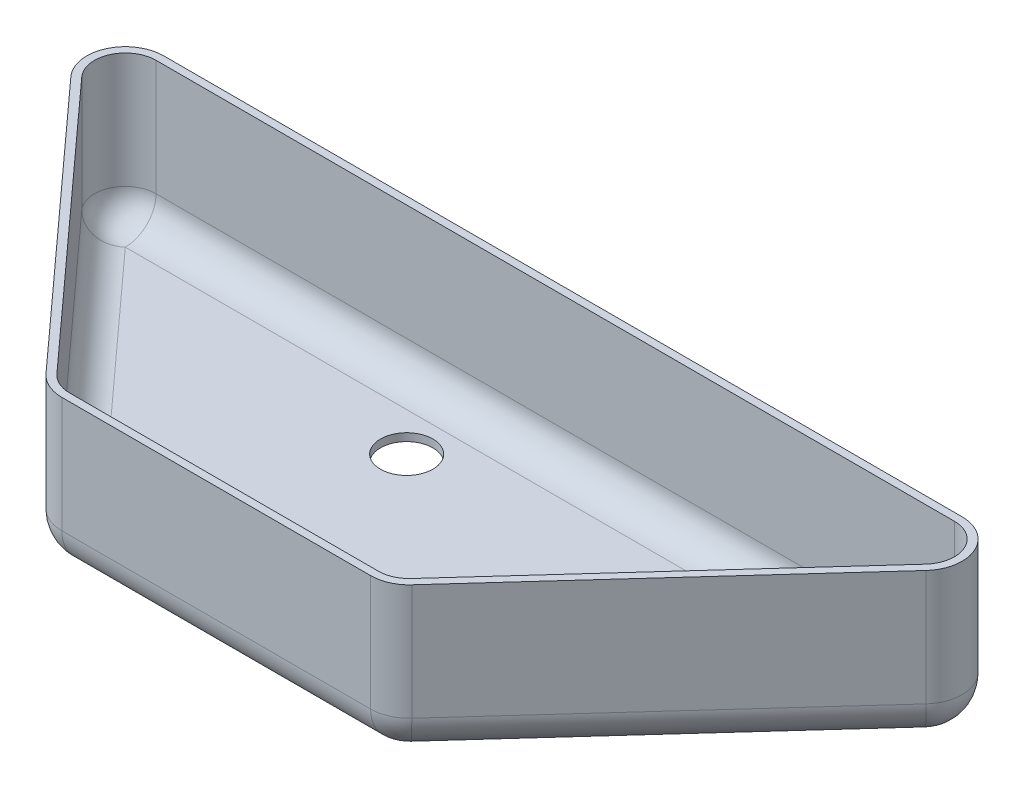
ISO-10303-21;
HEADER;
FILE_DESCRIPTION(('STEP AP214'),'2;1');
FILE_NAME('part.step','',(''),(''),'','','');
FILE_SCHEMA(('AUTOMOTIVE_DESIGN { 1 0 10303 214 1 1 1 1 }'));
ENDSEC;
DATA;
#1=APPLICATION_CONTEXT('core data for automotive mechanical design processes');
#2=APPLICATION_PROTOCOL_DEFINITION('international standard','automotive_design',2000,#1);
#3=PRODUCT_CONTEXT('',#1,'mechanical');
#4=PRODUCT('Part','Part','',(#3));
#5=PRODUCT_RELATED_PRODUCT_CATEGORY('part','',(#4));
#6=PRODUCT_DEFINITION_FORMATION('','',#4);
#7=PRODUCT_DEFINITION_CONTEXT('part definition',#1,'design');
#8=PRODUCT_DEFINITION('design','',#6,#7);
#9=PRODUCT_DEFINITION_SHAPE('','',#8);
#10=(LENGTH_UNIT() NAMED_UNIT(*) SI_UNIT(.MILLI.,.METRE.));
#11=(NAMED_UNIT(*) PLANE_ANGLE_UNIT() SI_UNIT($,.RADIAN.));
#12=(NAMED_UNIT(*) SI_UNIT($,.STERADIAN.) SOLID_ANGLE_UNIT());
#13=UNCERTAINTY_MEASURE_WITH_UNIT(LENGTH_MEASURE(1.E-05),#10,'distance_accuracy_value','');
#14=(GEOMETRIC_REPRESENTATION_CONTEXT(3) GLOBAL_UNCERTAINTY_ASSIGNED_CONTEXT((#13)) GLOBAL_UNIT_ASSIGNED_CONTEXT((#10,
#11,#12)) REPRESENTATION_CONTEXT('',''));
#15=CARTESIAN_POINT('',(0.,0.,0.));
#16=DIRECTION('',(0.,0.,1.));
#17=DIRECTION('',(1.,0.,0.));
#18=AXIS2_PLACEMENT_3D('',#15,#16,#17);
#19=CARTESIAN_POINT('',(50.8914392477294,50.8,-12.7));
#20=DIRECTION('',(0.,1.,0.));
#21=DIRECTION('',(0.,0.,1.));
#22=AXIS2_PLACEMENT_3D('',#19,#20,#21);
#23=PLANE('',#22);
#24=DIRECTION('',(-0.672140289067933,0.,0.740423819046683));
#25=VECTOR('',#24,1.);
#26=CARTESIAN_POINT('',(140.996266194066,50.8,-93.0638183288371));
#27=LINE('',#26,#25);
#28=CARTESIAN_POINT('',(140.996266194066,50.8,-93.0638183288371));
#29=VERTEX_POINT('',#28);
#30=CARTESIAN_POINT('',(60.2948217496223,50.8,-4.16381832883731));
#31=VERTEX_POINT('',#30);
#32=EDGE_CURVE('E281',#29,#31,#27,.T.);
#33=ORIENTED_EDGE('',*,*,#32,.F.);
#34=CARTESIAN_POINT('',(131.592883692174,50.8,-101.6));
#35=DIRECTION('',(0.,-1.,0.));
#36=DIRECTION('',(0.,0.,-1.));
#37=AXIS2_PLACEMENT_3D('',#34,#35,#36);
#38=CIRCLE('',#37,12.7);
#39=CARTESIAN_POINT('',(131.592883692174,50.8,-114.3));
#40=VERTEX_POINT('',#39);
#41=EDGE_CURVE('E298',#40,#29,#38,.T.);
#42=ORIENTED_EDGE('',*,*,#41,.F.);
#43=DIRECTION('',(1.,0.,0.));
#44=VECTOR('',#43,1.);
#45=CARTESIAN_POINT('',(-131.592883692174,50.8,-114.3));
#46=LINE('',#45,#44);
#47=CARTESIAN_POINT('',(-131.592883692174,50.8,-114.3));
#48=VERTEX_POINT('',#47);
#49=EDGE_CURVE('E295',#48,#40,#46,.T.);
#50=ORIENTED_EDGE('',*,*,#49,.F.);
#51=CARTESIAN_POINT('',(-131.592883692174,50.8,-101.6));
#52=DIRECTION('',(0.,1.,0.));
#53=DIRECTION('',(0.,0.,1.));
#54=AXIS2_PLACEMENT_3D('',#51,#52,#53);
#55=CIRCLE('',#54,12.7);
#56=CARTESIAN_POINT('',(-140.996266194067,50.8,-93.0638183288371));
#57=VERTEX_POINT('',#56);
#58=EDGE_CURVE('E293',#48,#57,#55,.T.);
#59=ORIENTED_EDGE('',*,*,#58,.T.);
#60=DIRECTION('',(0.672140289067933,0.,0.740423819046683));
#61=VECTOR('',#60,1.);
#62=CARTESIAN_POINT('',(-140.996266194067,50.8,-93.0638183288371));
#63=LINE('',#62,#61);
#64=CARTESIAN_POINT('',(-60.2948217496223,50.8,-4.16381832883729));
#65=VERTEX_POINT('',#64);
#66=EDGE_CURVE('E291',#57,#65,#63,.T.);
#67=ORIENTED_EDGE('',*,*,#66,.T.);
#68=CARTESIAN_POINT('',(-50.8914392477294,50.8,-12.7));
#69=DIRECTION('',(0.,-1.,0.));
#70=DIRECTION('',(0.,0.,-1.));
#71=AXIS2_PLACEMENT_3D('',#68,#69,#70);
#72=CIRCLE('',#71,12.7);
#73=CARTESIAN_POINT('',(-50.8914392477293,50.8,0.));
#74=VERTEX_POINT('',#73);
#75=EDGE_CURVE('E288',#74,#65,#72,.T.);
#76=ORIENTED_EDGE('',*,*,#75,.F.);
#77=DIRECTION('',(1.,0.,0.));
#78=VECTOR('',#77,1.);
#79=CARTESIAN_POINT('',(-50.8914392477293,50.8,0.));
#80=LINE('',#79,#78);
#81=CARTESIAN_POINT('',(50.8914392477293,50.8,0.));
#82=VERTEX_POINT('',#81);
#83=EDGE_CURVE('E286',#74,#82,#80,.T.);
#84=ORIENTED_EDGE('',*,*,#83,.T.);
#85=CARTESIAN_POINT('',(50.8914392477294,50.8,-12.7));
#86=DIRECTION('',(0.,1.,0.));
#87=DIRECTION('',(0.,0.,1.));
#88=AXIS2_PLACEMENT_3D('',#85,#86,#87);
#89=CIRCLE('',#88,12.7);
#90=EDGE_CURVE('E284',#82,#31,#89,.T.);
#91=ORIENTED_EDGE('',*,*,#90,.T.);
#92=EDGE_LOOP('',(#33,#42,#50,#59,#67,#76,#84,#91));
#93=FACE_BOUND('',#92,.T.);
#94=CARTESIAN_POINT('',(131.592883692174,50.8,-101.6));
#95=DIRECTION('',(0.,1.,0.));
#96=DIRECTION('',(0.,0.,1.));
#97=AXIS2_PLACEMENT_3D('',#94,#95,#96);
#98=CIRCLE('',#97,10.16);
#99=CARTESIAN_POINT('',(131.592883692174,50.8,-111.76));
#100=VERTEX_POINT('',#99);
#101=CARTESIAN_POINT('',(139.115589693688,50.8,-94.7710546630696));
#102=VERTEX_POINT('',#101);
#103=EDGE_CURVE('E266',#100,#102,#98,.F.);
#104=ORIENTED_EDGE('',*,*,#103,.T.);
#105=DIRECTION('',(-0.672140289067933,0.,0.740423819046683));
#106=VECTOR('',#105,1.);
#107=CARTESIAN_POINT('',(139.115589693688,50.8,-94.7710546630696));
#108=LINE('',#107,#106);
#109=CARTESIAN_POINT('',(58.4141452492437,50.8,-5.87105466306985));
#110=VERTEX_POINT('',#109);
#111=EDGE_CURVE('E194',#102,#110,#108,.T.);
#112=ORIENTED_EDGE('',*,*,#111,.T.);
#113=CARTESIAN_POINT('',(50.8914392477294,50.8,-12.7));
#114=DIRECTION('',(0.,1.,0.));
#115=DIRECTION('',(0.,0.,1.));
#116=AXIS2_PLACEMENT_3D('',#113,#114,#115);
#117=CIRCLE('',#116,10.16);
#118=CARTESIAN_POINT('',(50.8914392477293,50.8,-2.54000000000001));
#119=VERTEX_POINT('',#118);
#120=EDGE_CURVE('E265',#119,#110,#117,.T.);
#121=ORIENTED_EDGE('',*,*,#120,.F.);
#122=DIRECTION('',(1.,0.,0.));
#123=VECTOR('',#122,1.);
#124=CARTESIAN_POINT('',(-50.8914392477293,50.8,-2.54));
#125=LINE('',#124,#123);
#126=CARTESIAN_POINT('',(-50.8914392477293,50.8,-2.54));
#127=VERTEX_POINT('',#126);
#128=EDGE_CURVE('E278',#127,#119,#125,.T.);
#129=ORIENTED_EDGE('',*,*,#128,.F.);
#130=CARTESIAN_POINT('',(-50.8914392477294,50.8,-12.7));
#131=DIRECTION('',(0.,1.,0.));
#132=DIRECTION('',(0.,0.,1.));
#133=AXIS2_PLACEMENT_3D('',#130,#131,#132);
#134=CIRCLE('',#133,10.16);
#135=CARTESIAN_POINT('',(-58.4141452492437,50.8,-5.87105466306981));
#136=VERTEX_POINT('',#135);
#137=EDGE_CURVE('E275',#127,#136,#134,.F.);
#138=ORIENTED_EDGE('',*,*,#137,.T.);
#139=DIRECTION('',(0.672140289067933,0.,0.740423819046683));
#140=VECTOR('',#139,1.);
#141=CARTESIAN_POINT('',(-139.115589693688,50.8,-94.7710546630696));
#142=LINE('',#141,#140);
#143=CARTESIAN_POINT('',(-139.115589693688,50.8,-94.7710546630696));
#144=VERTEX_POINT('',#143);
#145=EDGE_CURVE('E273',#144,#136,#142,.T.);
#146=ORIENTED_EDGE('',*,*,#145,.F.);
#147=CARTESIAN_POINT('',(-131.592883692174,50.8,-101.6));
#148=DIRECTION('',(0.,1.,0.));
#149=DIRECTION('',(0.,0.,1.));
#150=AXIS2_PLACEMENT_3D('',#147,#148,#149);
#151=CIRCLE('',#150,10.16);
#152=CARTESIAN_POINT('',(-131.592883692174,50.8,-111.76));
#153=VERTEX_POINT('',#152);
#154=EDGE_CURVE('E271',#153,#144,#151,.T.);
#155=ORIENTED_EDGE('',*,*,#154,.F.);
#156=DIRECTION('',(1.,0.,0.));
#157=VECTOR('',#156,1.);
#158=CARTESIAN_POINT('',(-131.592883692174,50.8,-111.76));
#159=LINE('',#158,#157);
#160=EDGE_CURVE('E268',#153,#100,#159,.T.);
#161=ORIENTED_EDGE('',*,*,#160,.T.);
#162=EDGE_LOOP('',(#104,#112,#121,#129,#138,#146,#155,#161));
#163=FACE_BOUND('',#162,.T.);
#164=ADVANCED_FACE('F36',(#93,#163),#23,.T.);
#165=CARTESIAN_POINT('',(140.996266194066,50.8,-93.0638183288371));
#166=DIRECTION('',(0.740423819046683,0.,0.672140289067933));
#167=DIRECTION('',(0.672140289067933,0.,-0.740423819046683));
#168=AXIS2_PLACEMENT_3D('',#165,#166,#167);
#169=PLANE('',#168);
#170=DIRECTION('',(0.,-1.,0.));
#171=VECTOR('',#170,1.);
#172=CARTESIAN_POINT('',(60.2948217496223,50.8,-4.16381832883731));
#173=LINE('',#172,#171);
#174=CARTESIAN_POINT('',(60.2948217496223,12.7,-4.16381832883731));
#175=VERTEX_POINT('',#174);
#176=EDGE_CURVE('E301',#31,#175,#173,.T.);
#177=ORIENTED_EDGE('',*,*,#176,.T.);
#178=DIRECTION('',(-0.672140289067933,0.,0.740423819046683));
#179=VECTOR('',#178,1.);
#180=CARTESIAN_POINT('',(140.996266194067,12.7,-93.0638183288371));
#181=LINE('',#180,#179);
#182=CARTESIAN_POINT('',(140.996266194066,12.7,-93.0638183288371));
#183=VERTEX_POINT('',#182);
#184=EDGE_CURVE('E339',#175,#183,#181,.F.);
#185=ORIENTED_EDGE('',*,*,#184,.T.);
#186=DIRECTION('',(0.,-1.,0.));
#187=VECTOR('',#186,1.);
#188=CARTESIAN_POINT('',(140.996266194066,50.8,-93.0638183288371));
#189=LINE('',#188,#187);
#190=EDGE_CURVE('E302',#29,#183,#189,.T.);
#191=ORIENTED_EDGE('',*,*,#190,.F.);
#192=ORIENTED_EDGE('',*,*,#32,.T.);
#193=EDGE_LOOP('',(#177,#185,#191,#192));
#194=FACE_BOUND('',#193,.T.);
#195=ADVANCED_FACE('F413',(#194),#169,.T.);
#196=CARTESIAN_POINT('',(131.592883692174,50.8,-101.6));
#197=DIRECTION('',(0.,-1.,0.));
#198=DIRECTION('',(0.,0.,-1.));
#199=AXIS2_PLACEMENT_3D('',#196,#197,#198);
#200=CYLINDRICAL_SURFACE('',#199,12.7);
#201=ORIENTED_EDGE('',*,*,#190,.T.);
#202=CARTESIAN_POINT('',(131.592883692174,12.7,-101.6));
#203=DIRECTION('',(0.,-1.,0.));
#204=DIRECTION('',(0.,0.,-1.));
#205=AXIS2_PLACEMENT_3D('',#202,#203,#204);
#206=CIRCLE('',#205,12.7);
#207=CARTESIAN_POINT('',(131.592883692174,12.7,-114.3));
#208=VERTEX_POINT('',#207);
#209=EDGE_CURVE('E337',#183,#208,#206,.F.);
#210=ORIENTED_EDGE('',*,*,#209,.T.);
#211=DIRECTION('',(0.,-1.,0.));
#212=VECTOR('',#211,1.);
#213=CARTESIAN_POINT('',(131.592883692174,50.8,-114.3));
#214=LINE('',#213,#212);
#215=EDGE_CURVE('E306',#40,#208,#214,.T.);
#216=ORIENTED_EDGE('',*,*,#215,.F.);
#217=ORIENTED_EDGE('',*,*,#41,.T.);
#218=EDGE_LOOP('',(#201,#210,#216,#217));
#219=FACE_BOUND('',#218,.T.);
#220=ADVANCED_FACE('F411',(#219),#200,.T.);
#221=CARTESIAN_POINT('',(-131.592883692174,50.8,-114.3));
#222=DIRECTION('',(0.,0.,-1.));
#223=DIRECTION('',(-1.,0.,0.));
#224=AXIS2_PLACEMENT_3D('',#221,#222,#223);
#225=PLANE('',#224);
#226=ORIENTED_EDGE('',*,*,#215,.T.);
#227=DIRECTION('',(1.,0.,0.));
#228=VECTOR('',#227,1.);
#229=CARTESIAN_POINT('',(-131.592883692174,12.7,-114.3));
#230=LINE('',#229,#228);
#231=CARTESIAN_POINT('',(-131.592883692174,12.7,-114.3));
#232=VERTEX_POINT('',#231);
#233=EDGE_CURVE('E335',#208,#232,#230,.F.);
#234=ORIENTED_EDGE('',*,*,#233,.T.);
#235=DIRECTION('',(0.,-1.,0.));
#236=VECTOR('',#235,1.);
#237=CARTESIAN_POINT('',(-131.592883692174,50.8,-114.3));
#238=LINE('',#237,#236);
#239=EDGE_CURVE('E309',#48,#232,#238,.T.);
#240=ORIENTED_EDGE('',*,*,#239,.F.);
#241=ORIENTED_EDGE('',*,*,#49,.T.);
#242=EDGE_LOOP('',(#226,#234,#240,#241));
#243=FACE_BOUND('',#242,.T.);
#244=ADVANCED_FACE('F406',(#243),#225,.T.);
#245=CARTESIAN_POINT('',(-131.592883692174,50.8,-101.6));
#246=DIRECTION('',(0.,-1.,0.));
#247=DIRECTION('',(0.,0.,-1.));
#248=AXIS2_PLACEMENT_3D('',#245,#246,#247);
#249=CYLINDRICAL_SURFACE('',#248,12.7);
#250=ORIENTED_EDGE('',*,*,#239,.T.);
#251=CARTESIAN_POINT('',(-131.592883692174,12.7,-101.6));
#252=DIRECTION('',(0.,-1.,0.));
#253=DIRECTION('',(0.,0.,-1.));
#254=AXIS2_PLACEMENT_3D('',#251,#252,#253);
#255=CIRCLE('',#254,12.7);
#256=CARTESIAN_POINT('',(-140.996266194067,12.7,-93.0638183288371));
#257=VERTEX_POINT('',#256);
#258=EDGE_CURVE('E305',#232,#257,#255,.F.);
#259=ORIENTED_EDGE('',*,*,#258,.T.);
#260=DIRECTION('',(0.,-1.,0.));
#261=VECTOR('',#260,1.);
#262=CARTESIAN_POINT('',(-140.996266194067,50.8,-93.0638183288371));
#263=LINE('',#262,#261);
#264=EDGE_CURVE('E312',#57,#257,#263,.T.);
#265=ORIENTED_EDGE('',*,*,#264,.F.);
#266=ORIENTED_EDGE('',*,*,#58,.F.);
#267=EDGE_LOOP('',(#250,#259,#265,#266));
#268=FACE_BOUND('',#267,.T.);
#269=ADVANCED_FACE('F395',(#268),#249,.T.);
#270=CARTESIAN_POINT('',(-140.996266194067,50.8,-93.0638183288371));
#271=DIRECTION('',(0.740423819046683,0.,-0.672140289067933));
#272=DIRECTION('',(-0.672140289067933,0.,-0.740423819046683));
#273=AXIS2_PLACEMENT_3D('',#270,#271,#272);
#274=PLANE('',#273);
#275=ORIENTED_EDGE('',*,*,#264,.T.);
#276=DIRECTION('',(0.672140289067933,0.,0.740423819046683));
#277=VECTOR('',#276,1.);
#278=CARTESIAN_POINT('',(-140.996266194067,12.7,-93.0638183288371));
#279=LINE('',#278,#277);
#280=CARTESIAN_POINT('',(-60.2948217496223,12.7,-4.16381832883729));
#281=VERTEX_POINT('',#280);
#282=EDGE_CURVE('E11',#257,#281,#279,.T.);
#283=ORIENTED_EDGE('',*,*,#282,.T.);
#284=DIRECTION('',(0.,-1.,0.));
#285=VECTOR('',#284,1.);
#286=CARTESIAN_POINT('',(-60.2948217496223,50.8,-4.16381832883729));
#287=LINE('',#286,#285);
#288=EDGE_CURVE('E314',#65,#281,#287,.T.);
#289=ORIENTED_EDGE('',*,*,#288,.F.);
#290=ORIENTED_EDGE('',*,*,#66,.F.);
#291=EDGE_LOOP('',(#275,#283,#289,#290));
#292=FACE_BOUND('',#291,.T.);
#293=ADVANCED_FACE('F398',(#292),#274,.F.);
#294=CARTESIAN_POINT('',(-50.8914392477294,50.8,-12.7));
#295=DIRECTION('',(0.,-1.,0.));
#296=DIRECTION('',(0.,0.,-1.));
#297=AXIS2_PLACEMENT_3D('',#294,#295,#296);
#298=CYLINDRICAL_SURFACE('',#297,12.7);
#299=ORIENTED_EDGE('',*,*,#288,.T.);
#300=CARTESIAN_POINT('',(-50.8914392477294,12.7,-12.7));
#301=DIRECTION('',(0.,-1.,0.));
#302=DIRECTION('',(0.,0.,-1.));
#303=AXIS2_PLACEMENT_3D('',#300,#301,#302);
#304=CIRCLE('',#303,12.7);
#305=CARTESIAN_POINT('',(-50.8914392477293,12.7,0.));
#306=VERTEX_POINT('',#305);
#307=EDGE_CURVE('E45',#281,#306,#304,.F.);
#308=ORIENTED_EDGE('',*,*,#307,.T.);
#309=DIRECTION('',(0.,-1.,0.));
#310=VECTOR('',#309,1.);
#311=CARTESIAN_POINT('',(-50.8914392477293,50.8,0.));
#312=LINE('',#311,#310);
#313=EDGE_CURVE('E316',#74,#306,#312,.T.);
#314=ORIENTED_EDGE('',*,*,#313,.F.);
#315=ORIENTED_EDGE('',*,*,#75,.T.);
#316=EDGE_LOOP('',(#299,#308,#314,#315));
#317=FACE_BOUND('',#316,.T.);
#318=ADVANCED_FACE('F426',(#317),#298,.T.);
#319=CARTESIAN_POINT('',(-50.8914392477293,50.8,0.));
#320=DIRECTION('',(0.,0.,-1.));
#321=DIRECTION('',(-1.,0.,0.));
#322=AXIS2_PLACEMENT_3D('',#319,#320,#321);
#323=PLANE('',#322);
#324=ORIENTED_EDGE('',*,*,#313,.T.);
#325=DIRECTION('',(1.,0.,0.));
#326=VECTOR('',#325,1.);
#327=CARTESIAN_POINT('',(-50.8914392477293,12.7,0.));
#328=LINE('',#327,#326);
#329=CARTESIAN_POINT('',(50.8914392477293,12.7,0.));
#330=VERTEX_POINT('',#329);
#331=EDGE_CURVE('E343',#306,#330,#328,.T.);
#332=ORIENTED_EDGE('',*,*,#331,.T.);
#333=DIRECTION('',(0.,-1.,0.));
#334=VECTOR('',#333,1.);
#335=CARTESIAN_POINT('',(50.8914392477293,50.8,0.));
#336=LINE('',#335,#334);
#337=EDGE_CURVE('E319',#82,#330,#336,.T.);
#338=ORIENTED_EDGE('',*,*,#337,.F.);
#339=ORIENTED_EDGE('',*,*,#83,.F.);
#340=EDGE_LOOP('',(#324,#332,#338,#339));
#341=FACE_BOUND('',#340,.T.);
#342=ADVANCED_FACE('F421',(#341),#323,.F.);
#343=CARTESIAN_POINT('',(50.8914392477294,50.8,-12.7));
#344=DIRECTION('',(0.,-1.,0.));
#345=DIRECTION('',(0.,0.,-1.));
#346=AXIS2_PLACEMENT_3D('',#343,#344,#345);
#347=CYLINDRICAL_SURFACE('',#346,12.7);
#348=ORIENTED_EDGE('',*,*,#337,.T.);
#349=CARTESIAN_POINT('',(50.8914392477294,12.7,-12.7));
#350=DIRECTION('',(0.,-1.,0.));
#351=DIRECTION('',(0.,0.,-1.));
#352=AXIS2_PLACEMENT_3D('',#349,#350,#351);
#353=CIRCLE('',#352,12.7);
#354=EDGE_CURVE('E341',#330,#175,#353,.F.);
#355=ORIENTED_EDGE('',*,*,#354,.T.);
#356=ORIENTED_EDGE('',*,*,#176,.F.);
#357=ORIENTED_EDGE('',*,*,#90,.F.);
#358=EDGE_LOOP('',(#348,#355,#356,#357));
#359=FACE_BOUND('',#358,.T.);
#360=ADVANCED_FACE('F419',(#359),#347,.T.);
#361=CARTESIAN_POINT('',(50.8914392477294,0.,-12.7));
#362=DIRECTION('',(0.,1.,0.));
#363=DIRECTION('',(0.,0.,1.));
#364=AXIS2_PLACEMENT_3D('',#361,#362,#363);
#365=PLANE('',#364);
#366=CARTESIAN_POINT('',(-26.1272050749426,0.,-88.9));
#367=DIRECTION('',(0.,-1.,0.));
#368=DIRECTION('',(0.,0.,-1.));
#369=AXIS2_PLACEMENT_3D('',#366,#367,#368);
#370=CIRCLE('',#369,8.636);
#371=CARTESIAN_POINT('',(-26.1272050749426,0.,-97.536));
#372=VERTEX_POINT('',#371);
#373=EDGE_CURVE('E726',#372,#372,#370,.T.);
#374=ORIENTED_EDGE('',*,*,#373,.F.);
#375=EDGE_LOOP('',(#374));
#376=FACE_BOUND('',#375,.T.);
#377=DIRECTION('',(0.672140289067933,0.,0.740423819046683));
#378=VECTOR('',#377,1.);
#379=CARTESIAN_POINT('',(-4.90872683223578,0.,37.9541507637017));
#380=LINE('',#379,#378);
#381=CARTESIAN_POINT('',(-50.8914392477294,0.,-12.7));
#382=VERTEX_POINT('',#381);
#383=CARTESIAN_POINT('',(-131.592883692174,0.,-101.6));
#384=VERTEX_POINT('',#383);
#385=EDGE_CURVE('E326',#382,#384,#380,.F.);
#386=ORIENTED_EDGE('',*,*,#385,.T.);
#387=DIRECTION('',(1.,0.,0.));
#388=VECTOR('',#387,1.);
#389=CARTESIAN_POINT('',(131.592883692174,0.,-101.6));
#390=LINE('',#389,#388);
#391=CARTESIAN_POINT('',(131.592883692174,0.,-101.6));
#392=VERTEX_POINT('',#391);
#393=EDGE_CURVE('E332',#384,#392,#390,.T.);
#394=ORIENTED_EDGE('',*,*,#393,.T.);
#395=DIRECTION('',(-0.672140289067933,0.,0.740423819046683));
#396=VECTOR('',#395,1.);
#397=CARTESIAN_POINT('',(50.8914392477294,0.,-12.7000000000001));
#398=LINE('',#397,#396);
#399=CARTESIAN_POINT('',(50.8914392477294,0.,-12.7));
#400=VERTEX_POINT('',#399);
#401=EDGE_CURVE('E330',#392,#400,#398,.T.);
#402=ORIENTED_EDGE('',*,*,#401,.T.);
#403=DIRECTION('',(1.,0.,0.));
#404=VECTOR('',#403,1.);
#405=CARTESIAN_POINT('',(50.8914392477294,0.,-12.7));
#406=LINE('',#405,#404);
#407=EDGE_CURVE('E328',#400,#382,#406,.F.);
#408=ORIENTED_EDGE('',*,*,#407,.T.);
#409=EDGE_LOOP('',(#386,#394,#402,#408));
#410=FACE_BOUND('',#409,.T.);
#411=ADVANCED_FACE('F379',(#376,#410),#365,.F.);
#412=CARTESIAN_POINT('',(50.8914392477294,12.7,-12.7));
#413=DIRECTION('',(0.,1.,0.));
#414=DIRECTION('',(0.,0.,1.));
#415=AXIS2_PLACEMENT_3D('',#412,#413,#414);
#416=SPHERICAL_SURFACE('',#415,12.7);
#417=CARTESIAN_POINT('',(50.8914392477294,12.7,-12.7));
#418=DIRECTION('',(-1.,0.,0.));
#419=DIRECTION('',(0.,0.,1.));
#420=AXIS2_PLACEMENT_3D('',#417,#418,#419);
#421=CIRCLE('',#420,12.7);
#422=EDGE_CURVE('E360',#400,#330,#421,.T.);
#423=ORIENTED_EDGE('',*,*,#422,.F.);
#424=CARTESIAN_POINT('',(50.8914392477294,12.7,-12.7));
#425=DIRECTION('',(0.67214028906793,0.,-0.740423819046686));
#426=DIRECTION('',(-0.740423819046686,0.,-0.67214028906793));
#427=AXIS2_PLACEMENT_3D('',#424,#425,#426);
#428=CIRCLE('',#427,12.7);
#429=EDGE_CURVE('E40',#175,#400,#428,.T.);
#430=ORIENTED_EDGE('',*,*,#429,.F.);
#431=ORIENTED_EDGE('',*,*,#354,.F.);
#432=EDGE_LOOP('',(#423,#430,#431));
#433=FACE_BOUND('',#432,.T.);
#434=ADVANCED_FACE('F38',(#433),#416,.T.);
#435=CARTESIAN_POINT('',(50.8914392477294,12.7,-12.7));
#436=DIRECTION('',(0.672140289067933,0.,-0.740423819046683));
#437=DIRECTION('',(-0.740423819046683,0.,-0.672140289067933));
#438=AXIS2_PLACEMENT_3D('',#435,#436,#437);
#439=CYLINDRICAL_SURFACE('',#438,12.7);
#440=ORIENTED_EDGE('',*,*,#429,.T.);
#441=ORIENTED_EDGE('',*,*,#401,.F.);
#442=CARTESIAN_POINT('',(131.592883692174,12.7,-101.6));
#443=DIRECTION('',(0.672140289067933,0.,-0.740423819046683));
#444=DIRECTION('',(-0.740423819046683,0.,-0.672140289067933));
#445=AXIS2_PLACEMENT_3D('',#442,#443,#444);
#446=CIRCLE('',#445,12.7);
#447=EDGE_CURVE('E358',#183,#392,#446,.T.);
#448=ORIENTED_EDGE('',*,*,#447,.F.);
#449=ORIENTED_EDGE('',*,*,#184,.F.);
#450=EDGE_LOOP('',(#440,#441,#448,#449));
#451=FACE_BOUND('',#450,.T.);
#452=ADVANCED_FACE('F371',(#451),#439,.T.);
#453=CARTESIAN_POINT('',(-50.8914392477293,12.7,-12.7));
#454=DIRECTION('',(1.,0.,0.));
#455=DIRECTION('',(0.,0.,-1.));
#456=AXIS2_PLACEMENT_3D('',#453,#454,#455);
#457=CYLINDRICAL_SURFACE('',#456,12.7);
#458=ORIENTED_EDGE('',*,*,#422,.T.);
#459=ORIENTED_EDGE('',*,*,#331,.F.);
#460=CARTESIAN_POINT('',(-50.8914392477293,12.7,-12.7));
#461=DIRECTION('',(-1.,0.,0.));
#462=DIRECTION('',(0.,0.,1.));
#463=AXIS2_PLACEMENT_3D('',#460,#461,#462);
#464=CIRCLE('',#463,12.7);
#465=EDGE_CURVE('E355',#382,#306,#464,.T.);
#466=ORIENTED_EDGE('',*,*,#465,.F.);
#467=ORIENTED_EDGE('',*,*,#407,.F.);
#468=EDGE_LOOP('',(#458,#459,#466,#467));
#469=FACE_BOUND('',#468,.T.);
#470=ADVANCED_FACE('F376',(#469),#457,.T.);
#471=CARTESIAN_POINT('',(131.592883692174,12.7,-101.6));
#472=DIRECTION('',(0.,1.,0.));
#473=DIRECTION('',(0.,0.,1.));
#474=AXIS2_PLACEMENT_3D('',#471,#472,#473);
#475=SPHERICAL_SURFACE('',#474,12.7);
#476=ORIENTED_EDGE('',*,*,#209,.F.);
#477=ORIENTED_EDGE('',*,*,#447,.T.);
#478=CARTESIAN_POINT('',(131.592883692174,12.7,-101.6));
#479=DIRECTION('',(-1.,0.,0.));
#480=DIRECTION('',(0.,0.,1.));
#481=AXIS2_PLACEMENT_3D('',#478,#479,#480);
#482=CIRCLE('',#481,12.7);
#483=EDGE_CURVE('E353',#208,#392,#482,.T.);
#484=ORIENTED_EDGE('',*,*,#483,.F.);
#485=EDGE_LOOP('',(#476,#477,#484));
#486=FACE_BOUND('',#485,.T.);
#487=ADVANCED_FACE('F410',(#486),#475,.T.);
#488=CARTESIAN_POINT('',(-50.8914392477294,12.7,-12.7));
#489=DIRECTION('',(0.,1.,0.));
#490=DIRECTION('',(0.,0.,1.));
#491=AXIS2_PLACEMENT_3D('',#488,#489,#490);
#492=SPHERICAL_SURFACE('',#491,12.7);
#493=ORIENTED_EDGE('',*,*,#465,.T.);
#494=ORIENTED_EDGE('',*,*,#307,.F.);
#495=CARTESIAN_POINT('',(-50.8914392477294,12.7,-12.7));
#496=DIRECTION('',(-0.672140289067931,0.,-0.740423819046686));
#497=DIRECTION('',(-0.740423819046686,0.,0.672140289067931));
#498=AXIS2_PLACEMENT_3D('',#495,#496,#497);
#499=CIRCLE('',#498,12.7);
#500=EDGE_CURVE('E350',#382,#281,#499,.T.);
#501=ORIENTED_EDGE('',*,*,#500,.F.);
#502=EDGE_LOOP('',(#493,#494,#501));
#503=FACE_BOUND('',#502,.T.);
#504=ADVANCED_FACE('F424',(#503),#492,.T.);
#505=CARTESIAN_POINT('',(50.8914392477294,12.7,-101.6));
#506=DIRECTION('',(-1.,0.,0.));
#507=DIRECTION('',(0.,0.,1.));
#508=AXIS2_PLACEMENT_3D('',#505,#506,#507);
#509=CYLINDRICAL_SURFACE('',#508,12.7);
#510=ORIENTED_EDGE('',*,*,#483,.T.);
#511=ORIENTED_EDGE('',*,*,#393,.F.);
#512=CARTESIAN_POINT('',(-131.592883692174,12.7,-101.6));
#513=DIRECTION('',(-1.,0.,0.));
#514=DIRECTION('',(0.,-1.,0.));
#515=AXIS2_PLACEMENT_3D('',#512,#513,#514);
#516=CIRCLE('',#515,12.7);
#517=EDGE_CURVE('E347',#232,#384,#516,.T.);
#518=ORIENTED_EDGE('',*,*,#517,.F.);
#519=ORIENTED_EDGE('',*,*,#233,.F.);
#520=EDGE_LOOP('',(#510,#511,#518,#519));
#521=FACE_BOUND('',#520,.T.);
#522=ADVANCED_FACE('F384',(#521),#509,.T.);
#523=CARTESIAN_POINT('',(-131.592883692174,12.7,-101.6));
#524=DIRECTION('',(0.672140289067933,0.,0.740423819046683));
#525=DIRECTION('',(0.740423819046683,0.,-0.672140289067933));
#526=AXIS2_PLACEMENT_3D('',#523,#524,#525);
#527=CYLINDRICAL_SURFACE('',#526,12.7);
#528=ORIENTED_EDGE('',*,*,#500,.T.);
#529=ORIENTED_EDGE('',*,*,#282,.F.);
#530=CARTESIAN_POINT('',(-131.592883692174,12.7,-101.6));
#531=DIRECTION('',(-0.67214028906795,0.,-0.740423819046668));
#532=DIRECTION('',(-0.740423819046668,0.,0.67214028906795));
#533=AXIS2_PLACEMENT_3D('',#530,#531,#532);
#534=CIRCLE('',#533,12.7);
#535=EDGE_CURVE('E229',#384,#257,#534,.T.);
#536=ORIENTED_EDGE('',*,*,#535,.F.);
#537=ORIENTED_EDGE('',*,*,#385,.F.);
#538=EDGE_LOOP('',(#528,#529,#536,#537));
#539=FACE_BOUND('',#538,.T.);
#540=ADVANCED_FACE('F392',(#539),#527,.T.);
#541=CARTESIAN_POINT('',(-131.592883692174,12.7,-101.6));
#542=DIRECTION('',(0.,1.,0.));
#543=DIRECTION('',(0.,0.,1.));
#544=AXIS2_PLACEMENT_3D('',#541,#542,#543);
#545=SPHERICAL_SURFACE('',#544,12.7);
#546=ORIENTED_EDGE('',*,*,#258,.F.);
#547=ORIENTED_EDGE('',*,*,#517,.T.);
#548=ORIENTED_EDGE('',*,*,#535,.T.);
#549=EDGE_LOOP('',(#546,#547,#548));
#550=FACE_BOUND('',#549,.T.);
#551=ADVANCED_FACE('F390',(#550),#545,.T.);
#552=CARTESIAN_POINT('',(139.115589693688,50.8,-94.7710546630696));
#553=DIRECTION('',(0.740423819046683,0.,0.672140289067933));
#554=DIRECTION('',(0.672140289067933,0.,-0.740423819046683));
#555=AXIS2_PLACEMENT_3D('',#552,#553,#554);
#556=PLANE('',#555);
#557=DIRECTION('',(0.,1.,0.));
#558=VECTOR('',#557,1.);
#559=CARTESIAN_POINT('',(58.4141452492437,50.8,-5.87105466306982));
#560=LINE('',#559,#558);
#561=CARTESIAN_POINT('',(58.4141452492437,12.7,-5.87105466306985));
#562=VERTEX_POINT('',#561);
#563=EDGE_CURVE('E240',#110,#562,#560,.F.);
#564=ORIENTED_EDGE('',*,*,#563,.F.);
#565=ORIENTED_EDGE('',*,*,#111,.F.);
#566=DIRECTION('',(0.,-1.,0.));
#567=VECTOR('',#566,1.);
#568=CARTESIAN_POINT('',(139.115589693688,50.8,-94.7710546630697));
#569=LINE('',#568,#567);
#570=CARTESIAN_POINT('',(139.115589693688,12.7,-94.7710546630696));
#571=VERTEX_POINT('',#570);
#572=EDGE_CURVE('E191',#102,#571,#569,.T.);
#573=ORIENTED_EDGE('',*,*,#572,.T.);
#574=DIRECTION('',(0.672140289067933,0.,-0.740423819046683));
#575=VECTOR('',#574,1.);
#576=CARTESIAN_POINT('',(139.115589693688,12.7,-94.7710546630696));
#577=LINE('',#576,#575);
#578=EDGE_CURVE('E177',#562,#571,#577,.T.);
#579=ORIENTED_EDGE('',*,*,#578,.F.);
#580=EDGE_LOOP('',(#564,#565,#573,#579));
#581=FACE_BOUND('',#580,.T.);
#582=ADVANCED_FACE('F192',(#581),#556,.F.);
#583=CARTESIAN_POINT('',(131.592883692174,50.8,-101.6));
#584=DIRECTION('',(0.,-1.,0.));
#585=DIRECTION('',(0.,0.,-1.));
#586=AXIS2_PLACEMENT_3D('',#583,#584,#585);
#587=CYLINDRICAL_SURFACE('',#586,10.16);
#588=ORIENTED_EDGE('',*,*,#572,.F.);
#589=ORIENTED_EDGE('',*,*,#103,.F.);
#590=DIRECTION('',(0.,1.,0.));
#591=VECTOR('',#590,1.);
#592=CARTESIAN_POINT('',(131.592883692174,50.8,-111.76));
#593=LINE('',#592,#591);
#594=CARTESIAN_POINT('',(131.592883692174,12.7,-111.76));
#595=VERTEX_POINT('',#594);
#596=EDGE_CURVE('E200',#100,#595,#593,.F.);
#597=ORIENTED_EDGE('',*,*,#596,.T.);
#598=CARTESIAN_POINT('',(131.592883692174,12.7,-101.6));
#599=DIRECTION('',(0.,-1.,0.));
#600=DIRECTION('',(0.,0.,-1.));
#601=AXIS2_PLACEMENT_3D('',#598,#599,#600);
#602=CIRCLE('',#601,10.16);
#603=EDGE_CURVE('E188',#571,#595,#602,.F.);
#604=ORIENTED_EDGE('',*,*,#603,.F.);
#605=EDGE_LOOP('',(#588,#589,#597,#604));
#606=FACE_BOUND('',#605,.T.);
#607=ADVANCED_FACE('F210',(#606),#587,.F.);
#608=CARTESIAN_POINT('',(-131.592883692174,50.8,-111.76));
#609=DIRECTION('',(0.,0.,-1.));
#610=DIRECTION('',(-1.,0.,0.));
#611=AXIS2_PLACEMENT_3D('',#608,#609,#610);
#612=PLANE('',#611);
#613=ORIENTED_EDGE('',*,*,#596,.F.);
#614=ORIENTED_EDGE('',*,*,#160,.F.);
#615=DIRECTION('',(0.,-1.,0.));
#616=VECTOR('',#615,1.);
#617=CARTESIAN_POINT('',(-131.592883692174,50.8,-111.76));
#618=LINE('',#617,#616);
#619=CARTESIAN_POINT('',(-131.592883692174,12.7,-111.76));
#620=VERTEX_POINT('',#619);
#621=EDGE_CURVE('E216',#153,#620,#618,.T.);
#622=ORIENTED_EDGE('',*,*,#621,.T.);
#623=DIRECTION('',(-1.,0.,0.));
#624=VECTOR('',#623,1.);
#625=CARTESIAN_POINT('',(-131.592883692174,12.7,-111.76));
#626=LINE('',#625,#624);
#627=EDGE_CURVE('E211',#595,#620,#626,.T.);
#628=ORIENTED_EDGE('',*,*,#627,.F.);
#629=EDGE_LOOP('',(#613,#614,#622,#628));
#630=FACE_BOUND('',#629,.T.);
#631=ADVANCED_FACE('F563',(#630),#612,.F.);
#632=CARTESIAN_POINT('',(-131.592883692174,50.8,-101.6));
#633=DIRECTION('',(0.,-1.,0.));
#634=DIRECTION('',(0.,0.,-1.));
#635=AXIS2_PLACEMENT_3D('',#632,#633,#634);
#636=CYLINDRICAL_SURFACE('',#635,10.16);
#637=ORIENTED_EDGE('',*,*,#621,.F.);
#638=ORIENTED_EDGE('',*,*,#154,.T.);
#639=DIRECTION('',(0.,1.,0.));
#640=VECTOR('',#639,1.);
#641=CARTESIAN_POINT('',(-139.115589693688,50.8,-94.7710546630696));
#642=LINE('',#641,#640);
#643=CARTESIAN_POINT('',(-139.115589693688,12.7,-94.7710546630696));
#644=VERTEX_POINT('',#643);
#645=EDGE_CURVE('E220',#144,#644,#642,.F.);
#646=ORIENTED_EDGE('',*,*,#645,.T.);
#647=CARTESIAN_POINT('',(-131.592883692174,12.7,-101.6));
#648=DIRECTION('',(0.,-1.,0.));
#649=DIRECTION('',(0.,0.,-1.));
#650=AXIS2_PLACEMENT_3D('',#647,#648,#649);
#651=CIRCLE('',#650,10.16);
#652=EDGE_CURVE('E199',#620,#644,#651,.F.);
#653=ORIENTED_EDGE('',*,*,#652,.F.);
#654=EDGE_LOOP('',(#637,#638,#646,#653));
#655=FACE_BOUND('',#654,.T.);
#656=ADVANCED_FACE('F572',(#655),#636,.F.);
#657=CARTESIAN_POINT('',(-139.115589693688,50.8,-94.7710546630696));
#658=DIRECTION('',(0.740423819046683,0.,-0.672140289067933));
#659=DIRECTION('',(-0.672140289067933,0.,-0.740423819046683));
#660=AXIS2_PLACEMENT_3D('',#657,#658,#659);
#661=PLANE('',#660);
#662=ORIENTED_EDGE('',*,*,#645,.F.);
#663=ORIENTED_EDGE('',*,*,#145,.T.);
#664=DIRECTION('',(0.,-1.,0.));
#665=VECTOR('',#664,1.);
#666=CARTESIAN_POINT('',(-58.4141452492437,50.8,-5.87105466306983));
#667=LINE('',#666,#665);
#668=CARTESIAN_POINT('',(-58.4141452492437,12.7,-5.87105466306981));
#669=VERTEX_POINT('',#668);
#670=EDGE_CURVE('E226',#136,#669,#667,.T.);
#671=ORIENTED_EDGE('',*,*,#670,.T.);
#672=DIRECTION('',(-0.672140289067933,0.,-0.740423819046683));
#673=VECTOR('',#672,1.);
#674=CARTESIAN_POINT('',(-139.115589693688,12.7,-94.7710546630696));
#675=LINE('',#674,#673);
#676=EDGE_CURVE('E227',#644,#669,#675,.F.);
#677=ORIENTED_EDGE('',*,*,#676,.F.);
#678=EDGE_LOOP('',(#662,#663,#671,#677));
#679=FACE_BOUND('',#678,.T.);
#680=ADVANCED_FACE('F582',(#679),#661,.T.);
#681=CARTESIAN_POINT('',(-50.8914392477294,50.8,-12.7));
#682=DIRECTION('',(0.,-1.,0.));
#683=DIRECTION('',(0.,0.,-1.));
#684=AXIS2_PLACEMENT_3D('',#681,#682,#683);
#685=CYLINDRICAL_SURFACE('',#684,10.16);
#686=ORIENTED_EDGE('',*,*,#670,.F.);
#687=ORIENTED_EDGE('',*,*,#137,.F.);
#688=DIRECTION('',(0.,1.,0.));
#689=VECTOR('',#688,1.);
#690=CARTESIAN_POINT('',(-50.8914392477293,50.8,-2.54));
#691=LINE('',#690,#689);
#692=CARTESIAN_POINT('',(-50.8914392477293,12.7,-2.54));
#693=VERTEX_POINT('',#692);
#694=EDGE_CURVE('E233',#127,#693,#691,.F.);
#695=ORIENTED_EDGE('',*,*,#694,.T.);
#696=CARTESIAN_POINT('',(-50.8914392477294,12.7,-12.7));
#697=DIRECTION('',(0.,-1.,0.));
#698=DIRECTION('',(0.,0.,-1.));
#699=AXIS2_PLACEMENT_3D('',#696,#697,#698);
#700=CIRCLE('',#699,10.16);
#701=EDGE_CURVE('E230',#669,#693,#700,.F.);
#702=ORIENTED_EDGE('',*,*,#701,.F.);
#703=EDGE_LOOP('',(#686,#687,#695,#702));
#704=FACE_BOUND('',#703,.T.);
#705=ADVANCED_FACE('F592',(#704),#685,.F.);
#706=CARTESIAN_POINT('',(-50.8914392477293,50.8,-2.54));
#707=DIRECTION('',(0.,0.,-1.));
#708=DIRECTION('',(-1.,0.,0.));
#709=AXIS2_PLACEMENT_3D('',#706,#707,#708);
#710=PLANE('',#709);
#711=ORIENTED_EDGE('',*,*,#694,.F.);
#712=ORIENTED_EDGE('',*,*,#128,.T.);
#713=DIRECTION('',(0.,-1.,0.));
#714=VECTOR('',#713,1.);
#715=CARTESIAN_POINT('',(50.8914392477293,50.8,-2.54000000000001));
#716=LINE('',#715,#714);
#717=CARTESIAN_POINT('',(50.8914392477293,12.7,-2.54000000000001));
#718=VERTEX_POINT('',#717);
#719=EDGE_CURVE('E53',#119,#718,#716,.T.);
#720=ORIENTED_EDGE('',*,*,#719,.T.);
#721=DIRECTION('',(-1.,0.,0.));
#722=VECTOR('',#721,1.);
#723=CARTESIAN_POINT('',(-50.8914392477293,12.7,-2.54));
#724=LINE('',#723,#722);
#725=EDGE_CURVE('E235',#693,#718,#724,.F.);
#726=ORIENTED_EDGE('',*,*,#725,.F.);
#727=EDGE_LOOP('',(#711,#712,#720,#726));
#728=FACE_BOUND('',#727,.T.);
#729=ADVANCED_FACE('F602',(#728),#710,.T.);
#730=CARTESIAN_POINT('',(50.8914392477294,50.8,-12.7));
#731=DIRECTION('',(0.,-1.,0.));
#732=DIRECTION('',(0.,0.,-1.));
#733=AXIS2_PLACEMENT_3D('',#730,#731,#732);
#734=CYLINDRICAL_SURFACE('',#733,10.16);
#735=ORIENTED_EDGE('',*,*,#719,.F.);
#736=ORIENTED_EDGE('',*,*,#120,.T.);
#737=ORIENTED_EDGE('',*,*,#563,.T.);
#738=CARTESIAN_POINT('',(50.8914392477294,12.7,-12.7));
#739=DIRECTION('',(0.,-1.,0.));
#740=DIRECTION('',(0.,0.,-1.));
#741=AXIS2_PLACEMENT_3D('',#738,#739,#740);
#742=CIRCLE('',#741,10.16);
#743=EDGE_CURVE('E187',#718,#562,#742,.F.);
#744=ORIENTED_EDGE('',*,*,#743,.F.);
#745=EDGE_LOOP('',(#735,#736,#737,#744));
#746=FACE_BOUND('',#745,.T.);
#747=ADVANCED_FACE('F612',(#746),#734,.F.);
#748=CARTESIAN_POINT('',(50.8914392477294,2.54,-12.7));
#749=DIRECTION('',(0.,1.,0.));
#750=DIRECTION('',(0.,0.,1.));
#751=AXIS2_PLACEMENT_3D('',#748,#749,#750);
#752=PLANE('',#751);
#753=CARTESIAN_POINT('',(-26.1272050749426,2.54,-88.9));
#754=DIRECTION('',(0.,1.,0.));
#755=DIRECTION('',(0.,0.,1.));
#756=AXIS2_PLACEMENT_3D('',#753,#754,#755);
#757=CIRCLE('',#756,8.636);
#758=CARTESIAN_POINT('',(-26.1272050749426,2.54,-80.264));
#759=VERTEX_POINT('',#758);
#760=EDGE_CURVE('E260',#759,#759,#757,.F.);
#761=ORIENTED_EDGE('',*,*,#760,.T.);
#762=EDGE_LOOP('',(#761));
#763=FACE_BOUND('',#762,.T.);
#764=DIRECTION('',(0.672140289067933,0.,0.740423819046683));
#765=VECTOR('',#764,1.);
#766=CARTESIAN_POINT('',(-131.592883692174,2.54,-101.6));
#767=LINE('',#766,#765);
#768=CARTESIAN_POINT('',(-50.8914392477294,2.54,-12.7));
#769=VERTEX_POINT('',#768);
#770=CARTESIAN_POINT('',(-131.592883692174,2.54,-101.6));
#771=VERTEX_POINT('',#770);
#772=EDGE_CURVE('E223',#769,#771,#767,.F.);
#773=ORIENTED_EDGE('',*,*,#772,.F.);
#774=DIRECTION('',(1.,0.,0.));
#775=VECTOR('',#774,1.);
#776=CARTESIAN_POINT('',(50.8914392477294,2.54,-12.7));
#777=LINE('',#776,#775);
#778=CARTESIAN_POINT('',(50.8914392477294,2.54,-12.7));
#779=VERTEX_POINT('',#778);
#780=EDGE_CURVE('E246',#779,#769,#777,.F.);
#781=ORIENTED_EDGE('',*,*,#780,.F.);
#782=DIRECTION('',(0.672140289067933,0.,-0.740423819046683));
#783=VECTOR('',#782,1.);
#784=CARTESIAN_POINT('',(50.8914392477294,2.54,-12.7));
#785=LINE('',#784,#783);
#786=CARTESIAN_POINT('',(131.592883692174,2.54,-101.6));
#787=VERTEX_POINT('',#786);
#788=EDGE_CURVE('E249',#787,#779,#785,.F.);
#789=ORIENTED_EDGE('',*,*,#788,.F.);
#790=DIRECTION('',(1.,0.,0.));
#791=VECTOR('',#790,1.);
#792=CARTESIAN_POINT('',(50.8914392477294,2.54,-101.6));
#793=LINE('',#792,#791);
#794=EDGE_CURVE('E213',#771,#787,#793,.T.);
#795=ORIENTED_EDGE('',*,*,#794,.F.);
#796=EDGE_LOOP('',(#773,#781,#789,#795));
#797=FACE_BOUND('',#796,.T.);
#798=ADVANCED_FACE('F622',(#763,#797),#752,.T.);
#799=CARTESIAN_POINT('',(50.8914392477294,12.7,-12.7));
#800=DIRECTION('',(0.,1.,0.));
#801=DIRECTION('',(0.,0.,1.));
#802=AXIS2_PLACEMENT_3D('',#799,#800,#801);
#803=SPHERICAL_SURFACE('',#802,10.16);
#804=CARTESIAN_POINT('',(50.8914392477294,12.7,-12.7));
#805=DIRECTION('',(1.,0.,0.));
#806=DIRECTION('',(0.,0.,-1.));
#807=AXIS2_PLACEMENT_3D('',#804,#805,#806);
#808=CIRCLE('',#807,10.16);
#809=EDGE_CURVE('E207',#779,#718,#808,.F.);
#810=ORIENTED_EDGE('',*,*,#809,.T.);
#811=ORIENTED_EDGE('',*,*,#743,.T.);
#812=CARTESIAN_POINT('',(50.8914392477294,12.7,-12.7000000000001));
#813=DIRECTION('',(0.672140289067933,0.,-0.740423819046683));
#814=DIRECTION('',(-0.740423819046683,0.,-0.672140289067933));
#815=AXIS2_PLACEMENT_3D('',#812,#813,#814);
#816=CIRCLE('',#815,10.16);
#817=EDGE_CURVE('E184',#562,#779,#816,.T.);
#818=ORIENTED_EDGE('',*,*,#817,.T.);
#819=EDGE_LOOP('',(#810,#811,#818));
#820=FACE_BOUND('',#819,.T.);
#821=ADVANCED_FACE('F629',(#820),#803,.F.);
#822=CARTESIAN_POINT('',(50.8914392477294,12.7,-12.7));
#823=DIRECTION('',(0.672140289067933,0.,-0.740423819046683));
#824=DIRECTION('',(-0.740423819046683,0.,-0.672140289067933));
#825=AXIS2_PLACEMENT_3D('',#822,#823,#824);
#826=CYLINDRICAL_SURFACE('',#825,10.16);
#827=ORIENTED_EDGE('',*,*,#817,.F.);
#828=ORIENTED_EDGE('',*,*,#578,.T.);
#829=CARTESIAN_POINT('',(131.592883692174,12.7,-101.6));
#830=DIRECTION('',(-0.672140289067939,0.,0.740423819046678));
#831=DIRECTION('',(0.740423819046678,0.,0.672140289067939));
#832=AXIS2_PLACEMENT_3D('',#829,#830,#831);
#833=CIRCLE('',#832,10.16);
#834=EDGE_CURVE('E181',#571,#787,#833,.F.);
#835=ORIENTED_EDGE('',*,*,#834,.T.);
#836=ORIENTED_EDGE('',*,*,#788,.T.);
#837=EDGE_LOOP('',(#827,#828,#835,#836));
#838=FACE_BOUND('',#837,.T.);
#839=ADVANCED_FACE('F179',(#838),#826,.F.);
#840=CARTESIAN_POINT('',(-50.8914392477293,12.7,-12.7));
#841=DIRECTION('',(1.,0.,0.));
#842=DIRECTION('',(0.,0.,-1.));
#843=AXIS2_PLACEMENT_3D('',#840,#841,#842);
#844=CYLINDRICAL_SURFACE('',#843,10.16);
#845=ORIENTED_EDGE('',*,*,#809,.F.);
#846=ORIENTED_EDGE('',*,*,#780,.T.);
#847=CARTESIAN_POINT('',(-50.8914392477294,12.7,-12.7));
#848=DIRECTION('',(-1.,0.,0.));
#849=DIRECTION('',(0.,0.,1.));
#850=AXIS2_PLACEMENT_3D('',#847,#848,#849);
#851=CIRCLE('',#850,10.16);
#852=EDGE_CURVE('E208',#769,#693,#851,.T.);
#853=ORIENTED_EDGE('',*,*,#852,.T.);
#854=ORIENTED_EDGE('',*,*,#725,.T.);
#855=EDGE_LOOP('',(#845,#846,#853,#854));
#856=FACE_BOUND('',#855,.T.);
#857=ADVANCED_FACE('F643',(#856),#844,.F.);
#858=CARTESIAN_POINT('',(131.592883692174,12.7,-101.6));
#859=DIRECTION('',(0.,1.,0.));
#860=DIRECTION('',(0.,0.,1.));
#861=AXIS2_PLACEMENT_3D('',#858,#859,#860);
#862=SPHERICAL_SURFACE('',#861,10.16);
#863=ORIENTED_EDGE('',*,*,#603,.T.);
#864=CARTESIAN_POINT('',(131.592883692174,12.7,-101.6));
#865=DIRECTION('',(-1.,0.,0.));
#866=DIRECTION('',(0.,0.,1.));
#867=AXIS2_PLACEMENT_3D('',#864,#865,#866);
#868=CIRCLE('',#867,10.16);
#869=EDGE_CURVE('E206',#595,#787,#868,.T.);
#870=ORIENTED_EDGE('',*,*,#869,.T.);
#871=ORIENTED_EDGE('',*,*,#834,.F.);
#872=EDGE_LOOP('',(#863,#870,#871));
#873=FACE_BOUND('',#872,.T.);
#874=ADVANCED_FACE('F203',(#873),#862,.F.);
#875=CARTESIAN_POINT('',(-50.8914392477294,12.7,-12.7));
#876=DIRECTION('',(0.,1.,0.));
#877=DIRECTION('',(0.,0.,1.));
#878=AXIS2_PLACEMENT_3D('',#875,#876,#877);
#879=SPHERICAL_SURFACE('',#878,10.16);
#880=ORIENTED_EDGE('',*,*,#852,.F.);
#881=CARTESIAN_POINT('',(-50.8914392477294,12.7,-12.7));
#882=DIRECTION('',(0.672140289067933,0.,0.740423819046683));
#883=DIRECTION('',(0.740423819046683,0.,-0.672140289067933));
#884=AXIS2_PLACEMENT_3D('',#881,#882,#883);
#885=CIRCLE('',#884,10.16);
#886=EDGE_CURVE('E254',#769,#669,#885,.F.);
#887=ORIENTED_EDGE('',*,*,#886,.T.);
#888=ORIENTED_EDGE('',*,*,#701,.T.);
#889=EDGE_LOOP('',(#880,#887,#888));
#890=FACE_BOUND('',#889,.T.);
#891=ADVANCED_FACE('F661',(#890),#879,.F.);
#892=CARTESIAN_POINT('',(50.8914392477294,12.7,-101.6));
#893=DIRECTION('',(-1.,0.,0.));
#894=DIRECTION('',(0.,0.,1.));
#895=AXIS2_PLACEMENT_3D('',#892,#893,#894);
#896=CYLINDRICAL_SURFACE('',#895,10.16);
#897=ORIENTED_EDGE('',*,*,#869,.F.);
#898=ORIENTED_EDGE('',*,*,#627,.T.);
#899=CARTESIAN_POINT('',(-131.592883692174,12.7,-101.6));
#900=DIRECTION('',(1.,0.,0.));
#901=DIRECTION('',(0.,0.,-1.));
#902=AXIS2_PLACEMENT_3D('',#899,#900,#901);
#903=CIRCLE('',#902,10.16);
#904=EDGE_CURVE('E257',#620,#771,#903,.F.);
#905=ORIENTED_EDGE('',*,*,#904,.T.);
#906=ORIENTED_EDGE('',*,*,#794,.T.);
#907=EDGE_LOOP('',(#897,#898,#905,#906));
#908=FACE_BOUND('',#907,.T.);
#909=ADVANCED_FACE('F670',(#908),#896,.F.);
#910=CARTESIAN_POINT('',(-131.592883692174,12.7,-101.6));
#911=DIRECTION('',(0.672140289067933,0.,0.740423819046683));
#912=DIRECTION('',(0.740423819046683,0.,-0.672140289067933));
#913=AXIS2_PLACEMENT_3D('',#910,#911,#912);
#914=CYLINDRICAL_SURFACE('',#913,10.16);
#915=ORIENTED_EDGE('',*,*,#886,.F.);
#916=ORIENTED_EDGE('',*,*,#772,.T.);
#917=CARTESIAN_POINT('',(-131.592883692174,12.7,-101.6));
#918=DIRECTION('',(-0.672140289067948,0.,-0.74042381904667));
#919=DIRECTION('',(-0.74042381904667,0.,0.672140289067948));
#920=AXIS2_PLACEMENT_3D('',#917,#918,#919);
#921=CIRCLE('',#920,10.16);
#922=EDGE_CURVE('E258',#771,#644,#921,.T.);
#923=ORIENTED_EDGE('',*,*,#922,.T.);
#924=ORIENTED_EDGE('',*,*,#676,.T.);
#925=EDGE_LOOP('',(#915,#916,#923,#924));
#926=FACE_BOUND('',#925,.T.);
#927=ADVANCED_FACE('F680',(#926),#914,.F.);
#928=CARTESIAN_POINT('',(-131.592883692174,12.7,-101.6));
#929=DIRECTION('',(0.,1.,0.));
#930=DIRECTION('',(0.,0.,1.));
#931=AXIS2_PLACEMENT_3D('',#928,#929,#930);
#932=SPHERICAL_SURFACE('',#931,10.16);
#933=ORIENTED_EDGE('',*,*,#652,.T.);
#934=ORIENTED_EDGE('',*,*,#922,.F.);
#935=ORIENTED_EDGE('',*,*,#904,.F.);
#936=EDGE_LOOP('',(#933,#934,#935));
#937=FACE_BOUND('',#936,.T.);
#938=ADVANCED_FACE('F443',(#937),#932,.F.);
#939=CARTESIAN_POINT('',(-26.1272050749426,26.9662966493081,-88.9));
#940=DIRECTION('',(0.,-1.,0.));
#941=DIRECTION('',(0.,0.,-1.));
#942=AXIS2_PLACEMENT_3D('',#939,#940,#941);
#943=CYLINDRICAL_SURFACE('',#942,8.636);
#944=ORIENTED_EDGE('',*,*,#373,.T.);
#945=EDGE_LOOP('',(#944));
#946=FACE_BOUND('',#945,.T.);
#947=ORIENTED_EDGE('',*,*,#760,.F.);
#948=EDGE_LOOP('',(#947));
#949=FACE_BOUND('',#948,.T.);
#950=ADVANCED_FACE('F698',(#946,#949),#943,.F.);
#951=CLOSED_SHELL('',(#164,#195,#220,#244,#269,#293,#318,#342,#360,#411,#434,#452,#470,#487,
#504,#522,#540,#551,#582,#607,#631,#656,#680,#705,#729,#747,#798,#821,#839,#857,#874,#891,#909,
#927,#938,#950));
#952=MANIFOLD_SOLID_BREP('B2',#951);
#953=ADVANCED_BREP_SHAPE_REPRESENTATION('',(#18,#952),#14);
#954=SHAPE_DEFINITION_REPRESENTATION(#9,#953);
ENDSEC;
END-ISO-10303-21;
